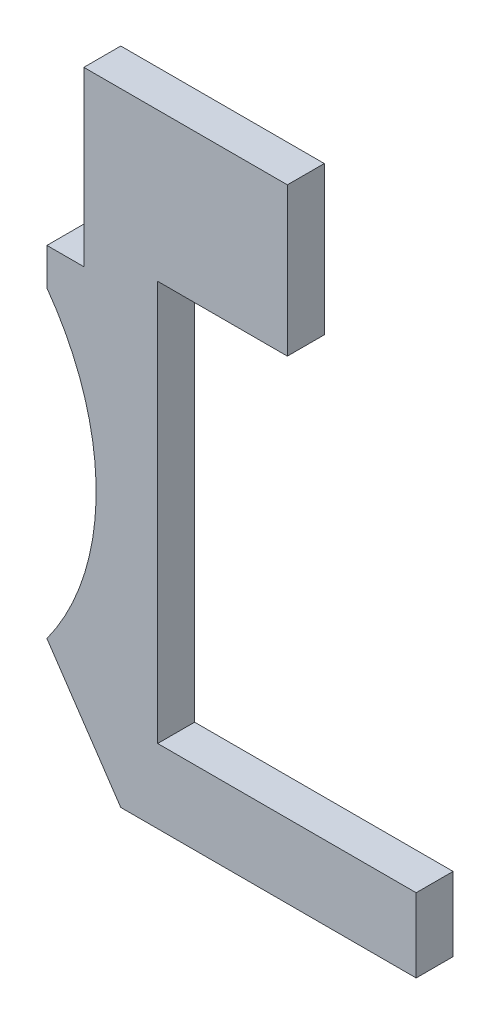
ISO-10303-21;
HEADER;
FILE_DESCRIPTION(('STEP AP214'),'2;1');
FILE_NAME('part.step','',(''),(''),'','','');
FILE_SCHEMA(('AUTOMOTIVE_DESIGN { 1 0 10303 214 1 1 1 1 }'));
ENDSEC;
DATA;
#1=APPLICATION_CONTEXT('core data for automotive mechanical design processes');
#2=APPLICATION_PROTOCOL_DEFINITION('international standard','automotive_design',2000,#1);
#3=PRODUCT_CONTEXT('',#1,'mechanical');
#4=PRODUCT('Part','Part','',(#3));
#5=PRODUCT_RELATED_PRODUCT_CATEGORY('part','',(#4));
#6=PRODUCT_DEFINITION_FORMATION('','',#4);
#7=PRODUCT_DEFINITION_CONTEXT('part definition',#1,'design');
#8=PRODUCT_DEFINITION('design','',#6,#7);
#9=PRODUCT_DEFINITION_SHAPE('','',#8);
#10=(LENGTH_UNIT() NAMED_UNIT(*) SI_UNIT(.MILLI.,.METRE.));
#11=(NAMED_UNIT(*) PLANE_ANGLE_UNIT() SI_UNIT($,.RADIAN.));
#12=(NAMED_UNIT(*) SI_UNIT($,.STERADIAN.) SOLID_ANGLE_UNIT());
#13=UNCERTAINTY_MEASURE_WITH_UNIT(LENGTH_MEASURE(1.E-05),#10,'distance_accuracy_value','');
#14=(GEOMETRIC_REPRESENTATION_CONTEXT(3) GLOBAL_UNCERTAINTY_ASSIGNED_CONTEXT((#13)) GLOBAL_UNIT_ASSIGNED_CONTEXT((#10,
#11,#12)) REPRESENTATION_CONTEXT('',''));
#15=CARTESIAN_POINT('',(0.,0.,0.));
#16=DIRECTION('',(0.,0.,1.));
#17=DIRECTION('',(1.,0.,0.));
#18=AXIS2_PLACEMENT_3D('',#15,#16,#17);
#19=CARTESIAN_POINT('',(10.,0.,5.));
#20=DIRECTION('',(0.828792257356721,0.55955642623917,0.));
#21=DIRECTION('',(-0.55955642623917,0.828792257356721,0.));
#22=AXIS2_PLACEMENT_3D('',#19,#20,#21);
#23=PLANE('',#22);
#24=DIRECTION('',(0.55955642623917,-0.828792257356721,0.));
#25=VECTOR('',#24,1.);
#26=CARTESIAN_POINT('',(10.,0.,0.));
#27=LINE('',#26,#25);
#28=CARTESIAN_POINT('',(0.,14.8115939428506,0.));
#29=VERTEX_POINT('',#28);
#30=CARTESIAN_POINT('',(10.,0.,0.));
#31=VERTEX_POINT('',#30);
#32=EDGE_CURVE('E153',#29,#31,#27,.T.);
#33=ORIENTED_EDGE('',*,*,#32,.T.);
#34=DIRECTION('',(0.,0.,-1.));
#35=VECTOR('',#34,1.);
#36=CARTESIAN_POINT('',(10.,0.,5.));
#37=LINE('',#36,#35);
#38=CARTESIAN_POINT('',(10.,0.,5.));
#39=VERTEX_POINT('',#38);
#40=EDGE_CURVE('E11',#39,#31,#37,.T.);
#41=ORIENTED_EDGE('',*,*,#40,.F.);
#42=DIRECTION('',(0.55955642623917,-0.828792257356721,0.));
#43=VECTOR('',#42,1.);
#44=CARTESIAN_POINT('',(10.,0.,5.));
#45=LINE('',#44,#43);
#46=CARTESIAN_POINT('',(0.,14.8115939428506,5.));
#47=VERTEX_POINT('',#46);
#48=EDGE_CURVE('E175',#47,#39,#45,.T.);
#49=ORIENTED_EDGE('',*,*,#48,.F.);
#50=DIRECTION('',(0.,0.,-1.));
#51=VECTOR('',#50,1.);
#52=CARTESIAN_POINT('',(0.,14.8115939428506,5.));
#53=LINE('',#52,#51);
#54=EDGE_CURVE('E149',#47,#29,#53,.T.);
#55=ORIENTED_EDGE('',*,*,#54,.T.);
#56=EDGE_LOOP('',(#33,#41,#49,#55));
#57=FACE_BOUND('',#56,.T.);
#58=ADVANCED_FACE('F33',(#57),#23,.F.);
#59=CARTESIAN_POINT('',(10.,0.,5.));
#60=DIRECTION('',(0.,1.,0.));
#61=DIRECTION('',(0.,0.,1.));
#62=AXIS2_PLACEMENT_3D('',#59,#60,#61);
#63=PLANE('',#62);
#64=DIRECTION('',(1.,0.,0.));
#65=VECTOR('',#64,1.);
#66=CARTESIAN_POINT('',(10.,0.,0.));
#67=LINE('',#66,#65);
#68=CARTESIAN_POINT('',(50.,0.,0.));
#69=VERTEX_POINT('',#68);
#70=EDGE_CURVE('E156',#31,#69,#67,.T.);
#71=ORIENTED_EDGE('',*,*,#70,.T.);
#72=DIRECTION('',(0.,0.,-1.));
#73=VECTOR('',#72,1.);
#74=CARTESIAN_POINT('',(50.,0.,5.));
#75=LINE('',#74,#73);
#76=CARTESIAN_POINT('',(50.,0.,5.));
#77=VERTEX_POINT('',#76);
#78=EDGE_CURVE('E41',#77,#69,#75,.T.);
#79=ORIENTED_EDGE('',*,*,#78,.F.);
#80=DIRECTION('',(1.,0.,0.));
#81=VECTOR('',#80,1.);
#82=CARTESIAN_POINT('',(10.,0.,5.));
#83=LINE('',#82,#81);
#84=EDGE_CURVE('E104',#39,#77,#83,.T.);
#85=ORIENTED_EDGE('',*,*,#84,.F.);
#86=ORIENTED_EDGE('',*,*,#40,.T.);
#87=EDGE_LOOP('',(#71,#79,#85,#86));
#88=FACE_BOUND('',#87,.T.);
#89=ADVANCED_FACE('F253',(#88),#63,.F.);
#90=CARTESIAN_POINT('',(50.,0.,5.));
#91=DIRECTION('',(-1.,0.,0.));
#92=DIRECTION('',(0.,0.,1.));
#93=AXIS2_PLACEMENT_3D('',#90,#91,#92);
#94=PLANE('',#93);
#95=DIRECTION('',(0.,1.,0.));
#96=VECTOR('',#95,1.);
#97=CARTESIAN_POINT('',(50.,0.,0.));
#98=LINE('',#97,#96);
#99=CARTESIAN_POINT('',(50.,10.,0.));
#100=VERTEX_POINT('',#99);
#101=EDGE_CURVE('E158',#69,#100,#98,.T.);
#102=ORIENTED_EDGE('',*,*,#101,.T.);
#103=DIRECTION('',(0.,0.,-1.));
#104=VECTOR('',#103,1.);
#105=CARTESIAN_POINT('',(50.,10.,5.));
#106=LINE('',#105,#104);
#107=CARTESIAN_POINT('',(50.,10.,5.));
#108=VERTEX_POINT('',#107);
#109=EDGE_CURVE('E194',#108,#100,#106,.T.);
#110=ORIENTED_EDGE('',*,*,#109,.F.);
#111=DIRECTION('',(0.,1.,0.));
#112=VECTOR('',#111,1.);
#113=CARTESIAN_POINT('',(50.,0.,5.));
#114=LINE('',#113,#112);
#115=EDGE_CURVE('E202',#77,#108,#114,.T.);
#116=ORIENTED_EDGE('',*,*,#115,.F.);
#117=ORIENTED_EDGE('',*,*,#78,.T.);
#118=EDGE_LOOP('',(#102,#110,#116,#117));
#119=FACE_BOUND('',#118,.T.);
#120=ADVANCED_FACE('F200',(#119),#94,.F.);
#121=CARTESIAN_POINT('',(50.,10.,5.));
#122=DIRECTION('',(0.,-1.,0.));
#123=DIRECTION('',(1.,0.,0.));
#124=AXIS2_PLACEMENT_3D('',#121,#122,#123);
#125=PLANE('',#124);
#126=DIRECTION('',(-1.,0.,0.));
#127=VECTOR('',#126,1.);
#128=CARTESIAN_POINT('',(50.,10.,0.));
#129=LINE('',#128,#127);
#130=CARTESIAN_POINT('',(15.,10.,0.));
#131=VERTEX_POINT('',#130);
#132=EDGE_CURVE('E160',#100,#131,#129,.T.);
#133=ORIENTED_EDGE('',*,*,#132,.T.);
#134=DIRECTION('',(0.,0.,-1.));
#135=VECTOR('',#134,1.);
#136=CARTESIAN_POINT('',(15.,10.,5.));
#137=LINE('',#136,#135);
#138=CARTESIAN_POINT('',(15.,10.,5.));
#139=VERTEX_POINT('',#138);
#140=EDGE_CURVE('E191',#139,#131,#137,.T.);
#141=ORIENTED_EDGE('',*,*,#140,.F.);
#142=DIRECTION('',(-1.,0.,0.));
#143=VECTOR('',#142,1.);
#144=CARTESIAN_POINT('',(50.,10.,5.));
#145=LINE('',#144,#143);
#146=EDGE_CURVE('E220',#108,#139,#145,.T.);
#147=ORIENTED_EDGE('',*,*,#146,.F.);
#148=ORIENTED_EDGE('',*,*,#109,.T.);
#149=EDGE_LOOP('',(#133,#141,#147,#148));
#150=FACE_BOUND('',#149,.T.);
#151=ADVANCED_FACE('F211',(#150),#125,.F.);
#152=CARTESIAN_POINT('',(15.,10.,5.));
#153=DIRECTION('',(-1.,0.,0.));
#154=DIRECTION('',(0.,0.,1.));
#155=AXIS2_PLACEMENT_3D('',#152,#153,#154);
#156=PLANE('',#155);
#157=DIRECTION('',(0.,1.,0.));
#158=VECTOR('',#157,1.);
#159=CARTESIAN_POINT('',(15.,10.,0.));
#160=LINE('',#159,#158);
#161=CARTESIAN_POINT('',(15.,64.2031015229694,0.));
#162=VERTEX_POINT('',#161);
#163=EDGE_CURVE('E162',#131,#162,#160,.T.);
#164=ORIENTED_EDGE('',*,*,#163,.T.);
#165=DIRECTION('',(0.,0.,-1.));
#166=VECTOR('',#165,1.);
#167=CARTESIAN_POINT('',(15.,64.2031015229694,5.));
#168=LINE('',#167,#166);
#169=CARTESIAN_POINT('',(15.,64.2031015229694,5.));
#170=VERTEX_POINT('',#169);
#171=EDGE_CURVE('E188',#170,#162,#168,.T.);
#172=ORIENTED_EDGE('',*,*,#171,.F.);
#173=DIRECTION('',(0.,1.,0.));
#174=VECTOR('',#173,1.);
#175=CARTESIAN_POINT('',(15.,10.,5.));
#176=LINE('',#175,#174);
#177=EDGE_CURVE('E217',#139,#170,#176,.T.);
#178=ORIENTED_EDGE('',*,*,#177,.F.);
#179=ORIENTED_EDGE('',*,*,#140,.T.);
#180=EDGE_LOOP('',(#164,#172,#178,#179));
#181=FACE_BOUND('',#180,.T.);
#182=ADVANCED_FACE('F215',(#181),#156,.F.);
#183=CARTESIAN_POINT('',(15.,64.2031015229694,5.));
#184=DIRECTION('',(0.,1.,0.));
#185=DIRECTION('',(0.,0.,1.));
#186=AXIS2_PLACEMENT_3D('',#183,#184,#185);
#187=PLANE('',#186);
#188=DIRECTION('',(1.,0.,0.));
#189=VECTOR('',#188,1.);
#190=CARTESIAN_POINT('',(15.,64.2031015229694,0.));
#191=LINE('',#190,#189);
#192=CARTESIAN_POINT('',(32.5610579942615,64.2031015229694,0.));
#193=VERTEX_POINT('',#192);
#194=EDGE_CURVE('E164',#162,#193,#191,.T.);
#195=ORIENTED_EDGE('',*,*,#194,.T.);
#196=DIRECTION('',(0.,0.,-1.));
#197=VECTOR('',#196,1.);
#198=CARTESIAN_POINT('',(32.5610579942615,64.2031015229694,5.));
#199=LINE('',#198,#197);
#200=CARTESIAN_POINT('',(32.5610579942615,64.2031015229694,5.));
#201=VERTEX_POINT('',#200);
#202=EDGE_CURVE('E185',#201,#193,#199,.T.);
#203=ORIENTED_EDGE('',*,*,#202,.F.);
#204=DIRECTION('',(1.,0.,0.));
#205=VECTOR('',#204,1.);
#206=CARTESIAN_POINT('',(15.,64.2031015229694,5.));
#207=LINE('',#206,#205);
#208=EDGE_CURVE('E219',#170,#201,#207,.T.);
#209=ORIENTED_EDGE('',*,*,#208,.F.);
#210=ORIENTED_EDGE('',*,*,#171,.T.);
#211=EDGE_LOOP('',(#195,#203,#209,#210));
#212=FACE_BOUND('',#211,.T.);
#213=ADVANCED_FACE('F266',(#212),#187,.F.);
#214=CARTESIAN_POINT('',(32.5610579942615,84.2946503439769,5.));
#215=DIRECTION('',(-1.,0.,0.));
#216=DIRECTION('',(0.,0.,1.));
#217=AXIS2_PLACEMENT_3D('',#214,#215,#216);
#218=PLANE('',#217);
#219=DIRECTION('',(0.,1.,0.));
#220=VECTOR('',#219,1.);
#221=CARTESIAN_POINT('',(32.5610579942615,84.2946503439769,0.));
#222=LINE('',#221,#220);
#223=CARTESIAN_POINT('',(32.5610579942615,84.2946503439769,0.));
#224=VERTEX_POINT('',#223);
#225=EDGE_CURVE('E166',#193,#224,#222,.T.);
#226=ORIENTED_EDGE('',*,*,#225,.T.);
#227=DIRECTION('',(0.,0.,-1.));
#228=VECTOR('',#227,1.);
#229=CARTESIAN_POINT('',(32.5610579942615,84.2946503439769,5.));
#230=LINE('',#229,#228);
#231=CARTESIAN_POINT('',(32.5610579942615,84.2946503439769,5.));
#232=VERTEX_POINT('',#231);
#233=EDGE_CURVE('E182',#232,#224,#230,.T.);
#234=ORIENTED_EDGE('',*,*,#233,.F.);
#235=DIRECTION('',(0.,1.,0.));
#236=VECTOR('',#235,1.);
#237=CARTESIAN_POINT('',(32.5610579942615,84.2946503439769,5.));
#238=LINE('',#237,#236);
#239=EDGE_CURVE('E222',#201,#232,#238,.T.);
#240=ORIENTED_EDGE('',*,*,#239,.F.);
#241=ORIENTED_EDGE('',*,*,#202,.T.);
#242=EDGE_LOOP('',(#226,#234,#240,#241));
#243=FACE_BOUND('',#242,.T.);
#244=ADVANCED_FACE('F269',(#243),#218,.F.);
#245=CARTESIAN_POINT('',(5.,84.2946503439769,5.));
#246=DIRECTION('',(0.,-1.,0.));
#247=DIRECTION('',(0.,0.,-1.));
#248=AXIS2_PLACEMENT_3D('',#245,#246,#247);
#249=PLANE('',#248);
#250=DIRECTION('',(-1.,0.,0.));
#251=VECTOR('',#250,1.);
#252=CARTESIAN_POINT('',(5.,84.2946503439769,0.));
#253=LINE('',#252,#251);
#254=CARTESIAN_POINT('',(5.,84.2946503439769,0.));
#255=VERTEX_POINT('',#254);
#256=EDGE_CURVE('E168',#224,#255,#253,.T.);
#257=ORIENTED_EDGE('',*,*,#256,.T.);
#258=DIRECTION('',(0.,0.,-1.));
#259=VECTOR('',#258,1.);
#260=CARTESIAN_POINT('',(5.,84.2946503439769,5.));
#261=LINE('',#260,#259);
#262=CARTESIAN_POINT('',(5.,84.2946503439769,5.));
#263=VERTEX_POINT('',#262);
#264=EDGE_CURVE('E179',#263,#255,#261,.T.);
#265=ORIENTED_EDGE('',*,*,#264,.F.);
#266=DIRECTION('',(-1.,0.,0.));
#267=VECTOR('',#266,1.);
#268=CARTESIAN_POINT('',(5.,84.2946503439769,5.));
#269=LINE('',#268,#267);
#270=EDGE_CURVE('E228',#232,#263,#269,.T.);
#271=ORIENTED_EDGE('',*,*,#270,.F.);
#272=ORIENTED_EDGE('',*,*,#233,.T.);
#273=EDGE_LOOP('',(#257,#265,#271,#272));
#274=FACE_BOUND('',#273,.T.);
#275=ADVANCED_FACE('F234',(#274),#249,.F.);
#276=CARTESIAN_POINT('',(5.,60.9123997451705,5.));
#277=DIRECTION('',(1.,0.,0.));
#278=DIRECTION('',(0.,0.,-1.));
#279=AXIS2_PLACEMENT_3D('',#276,#277,#278);
#280=PLANE('',#279);
#281=DIRECTION('',(0.,-1.,0.));
#282=VECTOR('',#281,1.);
#283=CARTESIAN_POINT('',(5.,60.9123997451705,0.));
#284=LINE('',#283,#282);
#285=CARTESIAN_POINT('',(5.,60.9123997451705,0.));
#286=VERTEX_POINT('',#285);
#287=EDGE_CURVE('E170',#255,#286,#284,.T.);
#288=ORIENTED_EDGE('',*,*,#287,.T.);
#289=DIRECTION('',(0.,0.,-1.));
#290=VECTOR('',#289,1.);
#291=CARTESIAN_POINT('',(5.,60.9123997451705,5.));
#292=LINE('',#291,#290);
#293=CARTESIAN_POINT('',(5.,60.9123997451705,5.));
#294=VERTEX_POINT('',#293);
#295=EDGE_CURVE('E144',#294,#286,#292,.T.);
#296=ORIENTED_EDGE('',*,*,#295,.F.);
#297=DIRECTION('',(0.,-1.,0.));
#298=VECTOR('',#297,1.);
#299=CARTESIAN_POINT('',(5.,60.9123997451705,5.));
#300=LINE('',#299,#298);
#301=EDGE_CURVE('E135',#263,#294,#300,.T.);
#302=ORIENTED_EDGE('',*,*,#301,.F.);
#303=ORIENTED_EDGE('',*,*,#264,.T.);
#304=EDGE_LOOP('',(#288,#296,#302,#303));
#305=FACE_BOUND('',#304,.T.);
#306=ADVANCED_FACE('F238',(#305),#280,.F.);
#307=CARTESIAN_POINT('',(0.,60.9123997451705,5.));
#308=DIRECTION('',(0.,-1.,0.));
#309=DIRECTION('',(0.,0.,-1.));
#310=AXIS2_PLACEMENT_3D('',#307,#308,#309);
#311=PLANE('',#310);
#312=DIRECTION('',(-1.,0.,0.));
#313=VECTOR('',#312,1.);
#314=CARTESIAN_POINT('',(0.,60.9123997451705,0.));
#315=LINE('',#314,#313);
#316=CARTESIAN_POINT('',(0.,60.9123997451705,0.));
#317=VERTEX_POINT('',#316);
#318=EDGE_CURVE('E143',#286,#317,#315,.T.);
#319=ORIENTED_EDGE('',*,*,#318,.T.);
#320=DIRECTION('',(0.,0.,-1.));
#321=VECTOR('',#320,1.);
#322=CARTESIAN_POINT('',(0.,60.9123997451705,5.));
#323=LINE('',#322,#321);
#324=CARTESIAN_POINT('',(0.,60.9123997451705,5.));
#325=VERTEX_POINT('',#324);
#326=EDGE_CURVE('E140',#325,#317,#323,.T.);
#327=ORIENTED_EDGE('',*,*,#326,.F.);
#328=DIRECTION('',(-1.,0.,0.));
#329=VECTOR('',#328,1.);
#330=CARTESIAN_POINT('',(0.,60.9123997451705,5.));
#331=LINE('',#330,#329);
#332=EDGE_CURVE('E129',#294,#325,#331,.T.);
#333=ORIENTED_EDGE('',*,*,#332,.F.);
#334=ORIENTED_EDGE('',*,*,#295,.T.);
#335=EDGE_LOOP('',(#319,#327,#333,#334));
#336=FACE_BOUND('',#335,.T.);
#337=ADVANCED_FACE('F141',(#336),#311,.F.);
#338=CARTESIAN_POINT('',(0.,60.9123997451705,5.));
#339=DIRECTION('',(1.,0.,0.));
#340=DIRECTION('',(0.,1.,0.));
#341=AXIS2_PLACEMENT_3D('',#338,#339,#340);
#342=PLANE('',#341);
#343=DIRECTION('',(0.,-1.,0.));
#344=VECTOR('',#343,1.);
#345=CARTESIAN_POINT('',(0.,60.9123997451705,0.));
#346=LINE('',#345,#344);
#347=CARTESIAN_POINT('',(0.,55.9123997451705,0.));
#348=VERTEX_POINT('',#347);
#349=EDGE_CURVE('E90',#317,#348,#346,.T.);
#350=ORIENTED_EDGE('',*,*,#349,.T.);
#351=DIRECTION('',(0.,0.,-1.));
#352=VECTOR('',#351,1.);
#353=CARTESIAN_POINT('',(0.,55.9123997451705,5.));
#354=LINE('',#353,#352);
#355=CARTESIAN_POINT('',(0.,55.9123997451705,5.));
#356=VERTEX_POINT('',#355);
#357=EDGE_CURVE('E145',#356,#348,#354,.T.);
#358=ORIENTED_EDGE('',*,*,#357,.F.);
#359=DIRECTION('',(0.,-1.,0.));
#360=VECTOR('',#359,1.);
#361=CARTESIAN_POINT('',(0.,60.9123997451705,5.));
#362=LINE('',#361,#360);
#363=EDGE_CURVE('E133',#325,#356,#362,.T.);
#364=ORIENTED_EDGE('',*,*,#363,.F.);
#365=ORIENTED_EDGE('',*,*,#326,.T.);
#366=EDGE_LOOP('',(#350,#358,#364,#365));
#367=FACE_BOUND('',#366,.T.);
#368=ADVANCED_FACE('F147',(#367),#342,.F.);
#369=CARTESIAN_POINT('',(-28.3316243904227,35.3619968440105,5.));
#370=DIRECTION('',(0.,0.,-1.));
#371=DIRECTION('',(-1.,0.,0.));
#372=AXIS2_PLACEMENT_3D('',#369,#370,#371);
#373=CYLINDRICAL_SURFACE('',#372,35.);
#374=CARTESIAN_POINT('',(-28.3316243904227,35.3619968440105,0.));
#375=DIRECTION('',(0.,0.,-1.));
#376=DIRECTION('',(1.,0.,0.));
#377=AXIS2_PLACEMENT_3D('',#374,#375,#376);
#378=CIRCLE('',#377,35.);
#379=EDGE_CURVE('E96',#348,#29,#378,.T.);
#380=ORIENTED_EDGE('',*,*,#379,.T.);
#381=ORIENTED_EDGE('',*,*,#54,.F.);
#382=CARTESIAN_POINT('',(-28.3316243904227,35.3619968440105,5.));
#383=DIRECTION('',(0.,0.,-1.));
#384=DIRECTION('',(1.,0.,0.));
#385=AXIS2_PLACEMENT_3D('',#382,#383,#384);
#386=CIRCLE('',#385,35.);
#387=EDGE_CURVE('E49',#356,#47,#386,.T.);
#388=ORIENTED_EDGE('',*,*,#387,.F.);
#389=ORIENTED_EDGE('',*,*,#357,.T.);
#390=EDGE_LOOP('',(#380,#381,#388,#389));
#391=FACE_BOUND('',#390,.T.);
#392=ADVANCED_FACE('F242',(#391),#373,.F.);
#393=CARTESIAN_POINT('',(-28.3316243904227,35.3619968440105,5.));
#394=DIRECTION('',(0.,0.,1.));
#395=DIRECTION('',(1.,0.,0.));
#396=AXIS2_PLACEMENT_3D('',#393,#394,#395);
#397=PLANE('',#396);
#398=ORIENTED_EDGE('',*,*,#48,.T.);
#399=ORIENTED_EDGE('',*,*,#84,.T.);
#400=ORIENTED_EDGE('',*,*,#115,.T.);
#401=ORIENTED_EDGE('',*,*,#146,.T.);
#402=ORIENTED_EDGE('',*,*,#177,.T.);
#403=ORIENTED_EDGE('',*,*,#208,.T.);
#404=ORIENTED_EDGE('',*,*,#239,.T.);
#405=ORIENTED_EDGE('',*,*,#270,.T.);
#406=ORIENTED_EDGE('',*,*,#301,.T.);
#407=ORIENTED_EDGE('',*,*,#332,.T.);
#408=ORIENTED_EDGE('',*,*,#363,.T.);
#409=ORIENTED_EDGE('',*,*,#387,.T.);
#410=EDGE_LOOP('',(#398,#399,#400,#401,#402,#403,#404,#405,#406,#407,#408,#409));
#411=FACE_BOUND('',#410,.T.);
#412=ADVANCED_FACE('F131',(#411),#397,.T.);
#413=CARTESIAN_POINT('',(-28.3316243904227,35.3619968440105,0.));
#414=DIRECTION('',(0.,0.,1.));
#415=DIRECTION('',(1.,0.,0.));
#416=AXIS2_PLACEMENT_3D('',#413,#414,#415);
#417=PLANE('',#416);
#418=ORIENTED_EDGE('',*,*,#32,.F.);
#419=ORIENTED_EDGE('',*,*,#379,.F.);
#420=ORIENTED_EDGE('',*,*,#349,.F.);
#421=ORIENTED_EDGE('',*,*,#318,.F.);
#422=ORIENTED_EDGE('',*,*,#287,.F.);
#423=ORIENTED_EDGE('',*,*,#256,.F.);
#424=ORIENTED_EDGE('',*,*,#225,.F.);
#425=ORIENTED_EDGE('',*,*,#194,.F.);
#426=ORIENTED_EDGE('',*,*,#163,.F.);
#427=ORIENTED_EDGE('',*,*,#132,.F.);
#428=ORIENTED_EDGE('',*,*,#101,.F.);
#429=ORIENTED_EDGE('',*,*,#70,.F.);
#430=EDGE_LOOP('',(#418,#419,#420,#421,#422,#423,#424,#425,#426,#427,#428,#429));
#431=FACE_BOUND('',#430,.T.);
#432=ADVANCED_FACE('F206',(#431),#417,.F.);
#433=CLOSED_SHELL('',(#58,#89,#120,#151,#182,#213,#244,#275,#306,#337,#368,#392,#412,#432));
#434=MANIFOLD_SOLID_BREP('B2',#433);
#435=ADVANCED_BREP_SHAPE_REPRESENTATION('',(#18,#434),#14);
#436=SHAPE_DEFINITION_REPRESENTATION(#9,#435);
ENDSEC;
END-ISO-10303-21;
